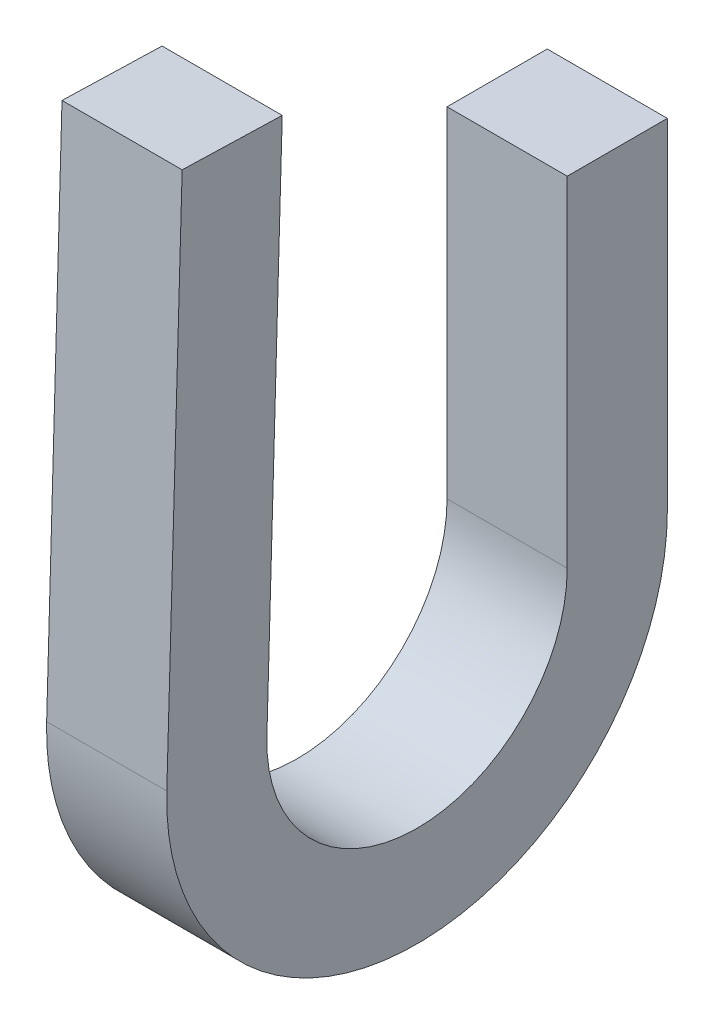
ISO-10303-21;
HEADER;
FILE_DESCRIPTION(('STEP AP214'),'2;1');
FILE_NAME('part.step','',(''),(''),'','','');
FILE_SCHEMA(('AUTOMOTIVE_DESIGN { 1 0 10303 214 1 1 1 1 }'));
ENDSEC;
DATA;
#1=APPLICATION_CONTEXT('core data for automotive mechanical design processes');
#2=APPLICATION_PROTOCOL_DEFINITION('international standard','automotive_design',2000,#1);
#3=PRODUCT_CONTEXT('',#1,'mechanical');
#4=PRODUCT('Part','Part','',(#3));
#5=PRODUCT_RELATED_PRODUCT_CATEGORY('part','',(#4));
#6=PRODUCT_DEFINITION_FORMATION('','',#4);
#7=PRODUCT_DEFINITION_CONTEXT('part definition',#1,'design');
#8=PRODUCT_DEFINITION('design','',#6,#7);
#9=PRODUCT_DEFINITION_SHAPE('','',#8);
#10=(LENGTH_UNIT() NAMED_UNIT(*) SI_UNIT(.MILLI.,.METRE.));
#11=(NAMED_UNIT(*) PLANE_ANGLE_UNIT() SI_UNIT($,.RADIAN.));
#12=(NAMED_UNIT(*) SI_UNIT($,.STERADIAN.) SOLID_ANGLE_UNIT());
#13=UNCERTAINTY_MEASURE_WITH_UNIT(LENGTH_MEASURE(1.E-05),#10,'distance_accuracy_value','');
#14=(GEOMETRIC_REPRESENTATION_CONTEXT(3) GLOBAL_UNCERTAINTY_ASSIGNED_CONTEXT((#13)) GLOBAL_UNIT_ASSIGNED_CONTEXT((#10,
#11,#12)) REPRESENTATION_CONTEXT('',''));
#15=CARTESIAN_POINT('',(0.,0.,0.));
#16=DIRECTION('',(0.,0.,1.));
#17=DIRECTION('',(1.,0.,0.));
#18=AXIS2_PLACEMENT_3D('',#15,#16,#17);
#19=CARTESIAN_POINT('',(-6.,-33.1828713156441,44.9895252636657));
#20=DIRECTION('',(0.,-0.0289448329514097,-0.999581010546626));
#21=DIRECTION('',(0.,0.999581010546627,-0.0289448329514097));
#22=AXIS2_PLACEMENT_3D('',#19,#20,#21);
#23=PLANE('',#22);
#24=DIRECTION('',(-1.,0.,0.));
#25=VECTOR('',#24,1.);
#26=CARTESIAN_POINT('',(-6.,-33.1828713156441,44.9895252636657));
#27=LINE('',#26,#25);
#28=CARTESIAN_POINT('',(6.,-33.1828713156441,44.9895252636657));
#29=VERTEX_POINT('',#28);
#30=CARTESIAN_POINT('',(-6.,-33.1828713156441,44.9895252636657));
#31=VERTEX_POINT('',#30);
#32=EDGE_CURVE('E110',#29,#31,#27,.T.);
#33=ORIENTED_EDGE('',*,*,#32,.F.);
#34=DIRECTION('',(0.,0.999581010546626,-0.0289448329514097));
#35=VECTOR('',#34,1.);
#36=CARTESIAN_POINT('',(6.,-33.1828713156441,44.9895252636657));
#37=LINE('',#36,#35);
#38=CARTESIAN_POINT('',(6.,19.7776067670322,43.4559505208926));
#39=VERTEX_POINT('',#38);
#40=EDGE_CURVE('E40',#29,#39,#37,.T.);
#41=ORIENTED_EDGE('',*,*,#40,.T.);
#42=DIRECTION('',(-1.,0.,0.));
#43=VECTOR('',#42,1.);
#44=CARTESIAN_POINT('',(-6.,19.7776067670322,43.4559505208926));
#45=LINE('',#44,#43);
#46=CARTESIAN_POINT('',(-6.,19.7776067670322,43.4559505208926));
#47=VERTEX_POINT('',#46);
#48=EDGE_CURVE('E47',#39,#47,#45,.T.);
#49=ORIENTED_EDGE('',*,*,#48,.T.);
#50=DIRECTION('',(0.,0.999581010546626,-0.0289448329514097));
#51=VECTOR('',#50,1.);
#52=CARTESIAN_POINT('',(-6.,-33.1828713156441,44.9895252636657));
#53=LINE('',#52,#51);
#54=EDGE_CURVE('E11',#31,#47,#53,.T.);
#55=ORIENTED_EDGE('',*,*,#54,.F.);
#56=EDGE_LOOP('',(#33,#41,#49,#55));
#57=FACE_BOUND('',#56,.T.);
#58=ADVANCED_FACE('F33',(#57),#23,.F.);
#59=CARTESIAN_POINT('',(-6.,-33.4723196451583,34.9937151581994));
#60=DIRECTION('',(0.,0.0289448329514097,0.999581010546626));
#61=DIRECTION('',(0.,-0.999581010546627,0.0289448329514097));
#62=AXIS2_PLACEMENT_3D('',#59,#60,#61);
#63=PLANE('',#62);
#64=DIRECTION('',(1.,0.,0.));
#65=VECTOR('',#64,1.);
#66=CARTESIAN_POINT('',(-6.,-33.4723196451583,34.9937151581994));
#67=LINE('',#66,#65);
#68=CARTESIAN_POINT('',(-6.,-33.4723196451583,34.9937151581994));
#69=VERTEX_POINT('',#68);
#70=CARTESIAN_POINT('',(6.,-33.4723196451583,34.9937151581994));
#71=VERTEX_POINT('',#70);
#72=EDGE_CURVE('E133',#69,#71,#67,.T.);
#73=ORIENTED_EDGE('',*,*,#72,.F.);
#74=DIRECTION('',(0.,0.999581010546626,-0.0289448329514097));
#75=VECTOR('',#74,1.);
#76=CARTESIAN_POINT('',(-6.,-33.4723196451583,34.9937151581994));
#77=LINE('',#76,#75);
#78=CARTESIAN_POINT('',(-6.,19.488158437518,33.4601404154264));
#79=VERTEX_POINT('',#78);
#80=EDGE_CURVE('E105',#69,#79,#77,.T.);
#81=ORIENTED_EDGE('',*,*,#80,.T.);
#82=DIRECTION('',(1.,0.,0.));
#83=VECTOR('',#82,1.);
#84=CARTESIAN_POINT('',(-6.,19.488158437518,33.4601404154264));
#85=LINE('',#84,#83);
#86=CARTESIAN_POINT('',(6.,19.488158437518,33.4601404154264));
#87=VERTEX_POINT('',#86);
#88=EDGE_CURVE('E147',#79,#87,#85,.T.);
#89=ORIENTED_EDGE('',*,*,#88,.T.);
#90=DIRECTION('',(0.,0.999581010546626,-0.0289448329514097));
#91=VECTOR('',#90,1.);
#92=CARTESIAN_POINT('',(6.,-33.4723196451583,34.9937151581994));
#93=LINE('',#92,#91);
#94=EDGE_CURVE('E152',#71,#87,#93,.T.);
#95=ORIENTED_EDGE('',*,*,#94,.F.);
#96=EDGE_LOOP('',(#73,#81,#89,#95));
#97=FACE_BOUND('',#96,.T.);
#98=ADVANCED_FACE('F179',(#97),#63,.F.);
#99=CARTESIAN_POINT('',(0.,-33.9064921394297,20.));
#100=DIRECTION('',(-1.,0.,0.));
#101=DIRECTION('',(0.,0.,1.));
#102=AXIS2_PLACEMENT_3D('',#99,#100,#101);
#103=CYLINDRICAL_SURFACE('',#102,25.);
#104=DIRECTION('',(-1.,0.,0.));
#105=VECTOR('',#104,1.);
#106=CARTESIAN_POINT('',(-6.,-33.9064921394297,-5.));
#107=LINE('',#106,#105);
#108=CARTESIAN_POINT('',(6.,-33.9064921394297,-5.));
#109=VERTEX_POINT('',#108);
#110=CARTESIAN_POINT('',(-6.,-33.9064921394297,-5.));
#111=VERTEX_POINT('',#110);
#112=EDGE_CURVE('E118',#109,#111,#107,.T.);
#113=ORIENTED_EDGE('',*,*,#112,.F.);
#114=CARTESIAN_POINT('',(6.,-33.9064921394297,20.));
#115=DIRECTION('',(-1.,0.,0.));
#116=DIRECTION('',(0.,0.,1.));
#117=AXIS2_PLACEMENT_3D('',#114,#115,#116);
#118=CIRCLE('',#117,25.);
#119=EDGE_CURVE('E139',#109,#29,#118,.T.);
#120=ORIENTED_EDGE('',*,*,#119,.T.);
#121=ORIENTED_EDGE('',*,*,#32,.T.);
#122=CARTESIAN_POINT('',(-6.,-33.9064921394297,20.));
#123=DIRECTION('',(-1.,0.,0.));
#124=DIRECTION('',(0.,0.,1.));
#125=AXIS2_PLACEMENT_3D('',#122,#123,#124);
#126=CIRCLE('',#125,25.);
#127=EDGE_CURVE('E142',#111,#31,#126,.T.);
#128=ORIENTED_EDGE('',*,*,#127,.F.);
#129=EDGE_LOOP('',(#113,#120,#121,#128));
#130=FACE_BOUND('',#129,.T.);
#131=ADVANCED_FACE('F160',(#130),#103,.T.);
#132=CARTESIAN_POINT('',(0.,-33.9064921394297,20.));
#133=DIRECTION('',(-1.,0.,0.));
#134=DIRECTION('',(0.,0.,1.));
#135=AXIS2_PLACEMENT_3D('',#132,#133,#134);
#136=CYLINDRICAL_SURFACE('',#135,15.);
#137=DIRECTION('',(1.,0.,0.));
#138=VECTOR('',#137,1.);
#139=CARTESIAN_POINT('',(-6.,-33.9064921394297,5.));
#140=LINE('',#139,#138);
#141=CARTESIAN_POINT('',(-6.,-33.9064921394297,5.));
#142=VERTEX_POINT('',#141);
#143=CARTESIAN_POINT('',(6.,-33.9064921394297,5.));
#144=VERTEX_POINT('',#143);
#145=EDGE_CURVE('E113',#142,#144,#140,.T.);
#146=ORIENTED_EDGE('',*,*,#145,.F.);
#147=CARTESIAN_POINT('',(-6.,-33.9064921394297,20.));
#148=DIRECTION('',(-1.,0.,0.));
#149=DIRECTION('',(0.,0.,1.));
#150=AXIS2_PLACEMENT_3D('',#147,#148,#149);
#151=CIRCLE('',#150,15.);
#152=EDGE_CURVE('E97',#142,#69,#151,.T.);
#153=ORIENTED_EDGE('',*,*,#152,.T.);
#154=ORIENTED_EDGE('',*,*,#72,.T.);
#155=CARTESIAN_POINT('',(6.,-33.9064921394297,20.));
#156=DIRECTION('',(-1.,0.,0.));
#157=DIRECTION('',(0.,0.,1.));
#158=AXIS2_PLACEMENT_3D('',#155,#156,#157);
#159=CIRCLE('',#158,15.);
#160=EDGE_CURVE('E109',#144,#71,#159,.T.);
#161=ORIENTED_EDGE('',*,*,#160,.F.);
#162=EDGE_LOOP('',(#146,#153,#154,#161));
#163=FACE_BOUND('',#162,.T.);
#164=ADVANCED_FACE('F114',(#163),#136,.F.);
#165=CARTESIAN_POINT('',(-6.,-33.9064921394297,5.));
#166=DIRECTION('',(-1.,0.,0.));
#167=DIRECTION('',(0.,0.,1.));
#168=AXIS2_PLACEMENT_3D('',#165,#166,#167);
#169=PLANE('',#168);
#170=DIRECTION('',(0.,0.,1.));
#171=VECTOR('',#170,1.);
#172=CARTESIAN_POINT('',(-6.,0.,5.));
#173=LINE('',#172,#171);
#174=CARTESIAN_POINT('',(-6.,0.,-5.));
#175=VERTEX_POINT('',#174);
#176=CARTESIAN_POINT('',(-6.,0.,5.));
#177=VERTEX_POINT('',#176);
#178=EDGE_CURVE('E172',#175,#177,#173,.T.);
#179=ORIENTED_EDGE('',*,*,#178,.F.);
#180=DIRECTION('',(0.,1.,0.));
#181=VECTOR('',#180,1.);
#182=CARTESIAN_POINT('',(-6.,-33.9064921394297,-5.));
#183=LINE('',#182,#181);
#184=EDGE_CURVE('E135',#111,#175,#183,.T.);
#185=ORIENTED_EDGE('',*,*,#184,.F.);
#186=ORIENTED_EDGE('',*,*,#127,.T.);
#187=ORIENTED_EDGE('',*,*,#54,.T.);
#188=DIRECTION('',(0.,-0.0289448329514239,-0.999581010546626));
#189=VECTOR('',#188,1.);
#190=CARTESIAN_POINT('',(-6.,19.488158437518,33.4601404154264));
#191=LINE('',#190,#189);
#192=EDGE_CURVE('E145',#47,#79,#191,.T.);
#193=ORIENTED_EDGE('',*,*,#192,.T.);
#194=ORIENTED_EDGE('',*,*,#80,.F.);
#195=ORIENTED_EDGE('',*,*,#152,.F.);
#196=DIRECTION('',(0.,1.,0.));
#197=VECTOR('',#196,1.);
#198=CARTESIAN_POINT('',(-6.,-33.9064921394297,5.));
#199=LINE('',#198,#197);
#200=EDGE_CURVE('E102',#142,#177,#199,.T.);
#201=ORIENTED_EDGE('',*,*,#200,.T.);
#202=EDGE_LOOP('',(#179,#185,#186,#187,#193,#194,#195,#201));
#203=FACE_BOUND('',#202,.T.);
#204=ADVANCED_FACE('F100',(#203),#169,.T.);
#205=CARTESIAN_POINT('',(-6.,-33.9064921394297,-5.));
#206=DIRECTION('',(0.,0.,-1.));
#207=DIRECTION('',(-1.,0.,0.));
#208=AXIS2_PLACEMENT_3D('',#205,#206,#207);
#209=PLANE('',#208);
#210=DIRECTION('',(-1.,0.,0.));
#211=VECTOR('',#210,1.);
#212=CARTESIAN_POINT('',(-6.,0.,-5.));
#213=LINE('',#212,#211);
#214=CARTESIAN_POINT('',(6.,0.,-5.));
#215=VERTEX_POINT('',#214);
#216=EDGE_CURVE('E119',#215,#175,#213,.T.);
#217=ORIENTED_EDGE('',*,*,#216,.F.);
#218=DIRECTION('',(0.,1.,0.));
#219=VECTOR('',#218,1.);
#220=CARTESIAN_POINT('',(6.,-33.9064921394297,-5.));
#221=LINE('',#220,#219);
#222=EDGE_CURVE('E127',#109,#215,#221,.T.);
#223=ORIENTED_EDGE('',*,*,#222,.F.);
#224=ORIENTED_EDGE('',*,*,#112,.T.);
#225=ORIENTED_EDGE('',*,*,#184,.T.);
#226=EDGE_LOOP('',(#217,#223,#224,#225));
#227=FACE_BOUND('',#226,.T.);
#228=ADVANCED_FACE('F164',(#227),#209,.T.);
#229=CARTESIAN_POINT('',(6.,-33.9064921394297,5.));
#230=DIRECTION('',(1.,0.,0.));
#231=DIRECTION('',(0.,0.,-1.));
#232=AXIS2_PLACEMENT_3D('',#229,#230,#231);
#233=PLANE('',#232);
#234=DIRECTION('',(0.,0.,-1.));
#235=VECTOR('',#234,1.);
#236=CARTESIAN_POINT('',(6.,0.,5.));
#237=LINE('',#236,#235);
#238=CARTESIAN_POINT('',(6.,0.,5.));
#239=VERTEX_POINT('',#238);
#240=EDGE_CURVE('E169',#239,#215,#237,.T.);
#241=ORIENTED_EDGE('',*,*,#240,.F.);
#242=DIRECTION('',(0.,1.,0.));
#243=VECTOR('',#242,1.);
#244=CARTESIAN_POINT('',(6.,-33.9064921394297,5.));
#245=LINE('',#244,#243);
#246=EDGE_CURVE('E125',#144,#239,#245,.T.);
#247=ORIENTED_EDGE('',*,*,#246,.F.);
#248=ORIENTED_EDGE('',*,*,#160,.T.);
#249=ORIENTED_EDGE('',*,*,#94,.T.);
#250=DIRECTION('',(0.,0.0289448329514239,0.999581010546626));
#251=VECTOR('',#250,1.);
#252=CARTESIAN_POINT('',(6.,19.488158437518,33.4601404154264));
#253=LINE('',#252,#251);
#254=EDGE_CURVE('E55',#87,#39,#253,.T.);
#255=ORIENTED_EDGE('',*,*,#254,.T.);
#256=ORIENTED_EDGE('',*,*,#40,.F.);
#257=ORIENTED_EDGE('',*,*,#119,.F.);
#258=ORIENTED_EDGE('',*,*,#222,.T.);
#259=EDGE_LOOP('',(#241,#247,#248,#249,#255,#256,#257,#258));
#260=FACE_BOUND('',#259,.T.);
#261=ADVANCED_FACE('F155',(#260),#233,.T.);
#262=CARTESIAN_POINT('',(-6.,-33.9064921394297,5.));
#263=DIRECTION('',(0.,0.,1.));
#264=DIRECTION('',(1.,0.,0.));
#265=AXIS2_PLACEMENT_3D('',#262,#263,#264);
#266=PLANE('',#265);
#267=DIRECTION('',(1.,0.,0.));
#268=VECTOR('',#267,1.);
#269=CARTESIAN_POINT('',(-6.,0.,5.));
#270=LINE('',#269,#268);
#271=EDGE_CURVE('E123',#177,#239,#270,.T.);
#272=ORIENTED_EDGE('',*,*,#271,.F.);
#273=ORIENTED_EDGE('',*,*,#200,.F.);
#274=ORIENTED_EDGE('',*,*,#145,.T.);
#275=ORIENTED_EDGE('',*,*,#246,.T.);
#276=EDGE_LOOP('',(#272,#273,#274,#275));
#277=FACE_BOUND('',#276,.T.);
#278=ADVANCED_FACE('F121',(#277),#266,.T.);
#279=CARTESIAN_POINT('',(0.,19.6328826022751,38.4580454681595));
#280=DIRECTION('',(0.,0.999581010546626,-0.0289448329514239));
#281=DIRECTION('',(0.,0.0289448329514239,0.999581010546626));
#282=AXIS2_PLACEMENT_3D('',#279,#280,#281);
#283=PLANE('',#282);
#284=ORIENTED_EDGE('',*,*,#192,.F.);
#285=ORIENTED_EDGE('',*,*,#48,.F.);
#286=ORIENTED_EDGE('',*,*,#254,.F.);
#287=ORIENTED_EDGE('',*,*,#88,.F.);
#288=EDGE_LOOP('',(#284,#285,#286,#287));
#289=FACE_BOUND('',#288,.T.);
#290=ADVANCED_FACE('F177',(#289),#283,.T.);
#291=CARTESIAN_POINT('',(0.,0.,0.));
#292=DIRECTION('',(0.,-1.,0.));
#293=DIRECTION('',(0.,0.,-1.));
#294=AXIS2_PLACEMENT_3D('',#291,#292,#293);
#295=PLANE('',#294);
#296=ORIENTED_EDGE('',*,*,#178,.T.);
#297=ORIENTED_EDGE('',*,*,#271,.T.);
#298=ORIENTED_EDGE('',*,*,#240,.T.);
#299=ORIENTED_EDGE('',*,*,#216,.T.);
#300=EDGE_LOOP('',(#296,#297,#298,#299));
#301=FACE_BOUND('',#300,.T.);
#302=ADVANCED_FACE('F174',(#301),#295,.F.);
#303=CLOSED_SHELL('',(#58,#98,#131,#164,#204,#228,#261,#278,#290,#302));
#304=MANIFOLD_SOLID_BREP('B2',#303);
#305=ADVANCED_BREP_SHAPE_REPRESENTATION('',(#18,#304),#14);
#306=SHAPE_DEFINITION_REPRESENTATION(#9,#305);
ENDSEC;
END-ISO-10303-21;
